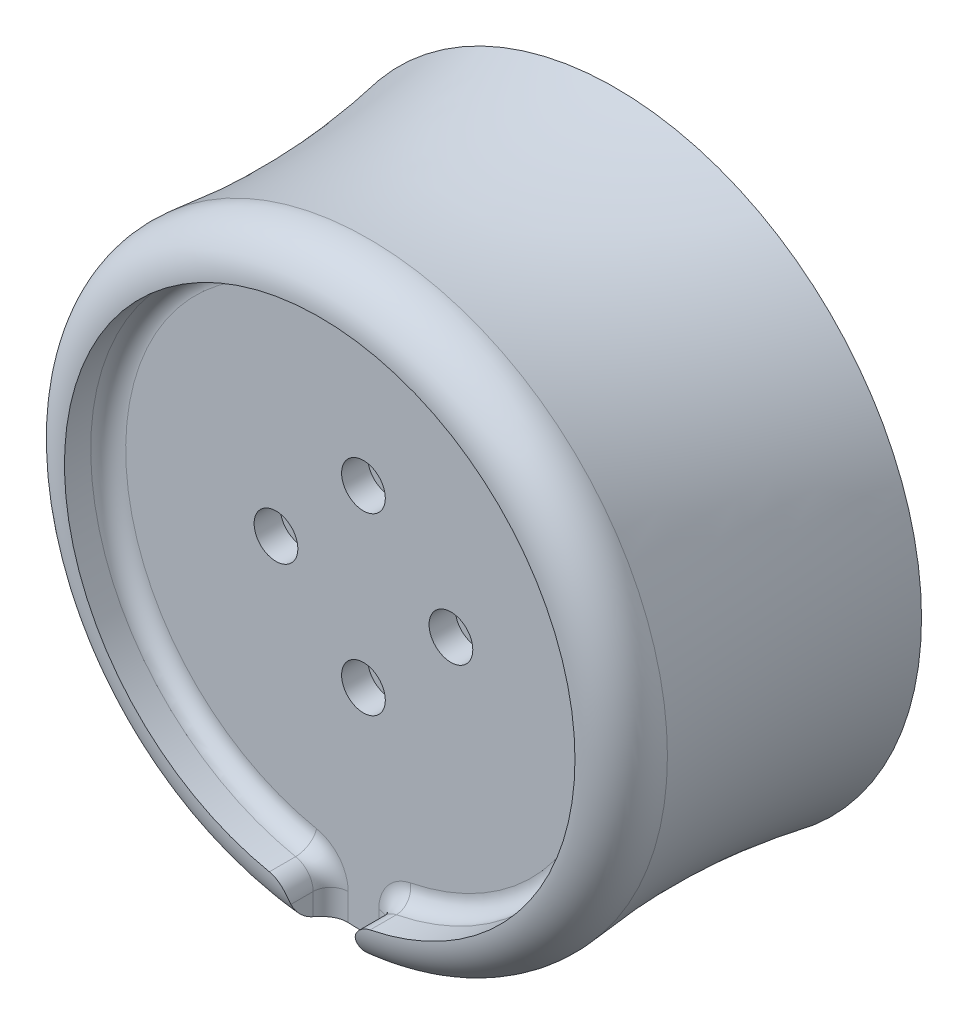
ISO-10303-21;
HEADER;
FILE_DESCRIPTION(('STEP AP214'),'2;1');
FILE_NAME('part.step','',(''),(''),'','','');
FILE_SCHEMA(('AUTOMOTIVE_DESIGN { 1 0 10303 214 1 1 1 1 }'));
ENDSEC;
DATA;
#1=APPLICATION_CONTEXT('core data for automotive mechanical design processes');
#2=APPLICATION_PROTOCOL_DEFINITION('international standard','automotive_design',2000,#1);
#3=PRODUCT_CONTEXT('',#1,'mechanical');
#4=PRODUCT('Part','Part','',(#3));
#5=PRODUCT_RELATED_PRODUCT_CATEGORY('part','',(#4));
#6=PRODUCT_DEFINITION_FORMATION('','',#4);
#7=PRODUCT_DEFINITION_CONTEXT('part definition',#1,'design');
#8=PRODUCT_DEFINITION('design','',#6,#7);
#9=PRODUCT_DEFINITION_SHAPE('','',#8);
#10=(LENGTH_UNIT() NAMED_UNIT(*) SI_UNIT(.MILLI.,.METRE.));
#11=(NAMED_UNIT(*) PLANE_ANGLE_UNIT() SI_UNIT($,.RADIAN.));
#12=(NAMED_UNIT(*) SI_UNIT($,.STERADIAN.) SOLID_ANGLE_UNIT());
#13=UNCERTAINTY_MEASURE_WITH_UNIT(LENGTH_MEASURE(1.E-05),#10,'distance_accuracy_value','');
#14=(GEOMETRIC_REPRESENTATION_CONTEXT(3) GLOBAL_UNCERTAINTY_ASSIGNED_CONTEXT((#13)) GLOBAL_UNIT_ASSIGNED_CONTEXT((#10,
#11,#12)) REPRESENTATION_CONTEXT('',''));
#15=CARTESIAN_POINT('',(0.,0.,0.));
#16=DIRECTION('',(0.,0.,1.));
#17=DIRECTION('',(1.,0.,0.));
#18=AXIS2_PLACEMENT_3D('',#15,#16,#17);
#19=CARTESIAN_POINT('',(0.,-10.,15.001));
#20=DIRECTION('',(0.,0.,-1.));
#21=DIRECTION('',(-1.,0.,0.));
#22=AXIS2_PLACEMENT_3D('',#19,#20,#21);
#23=CYLINDRICAL_SURFACE('',#22,1.5);
#24=CARTESIAN_POINT('',(0.,-10.,0.));
#25=DIRECTION('',(0.,0.,1.));
#26=DIRECTION('',(1.,0.,0.));
#27=AXIS2_PLACEMENT_3D('',#24,#25,#26);
#28=CIRCLE('',#27,1.5);
#29=CARTESIAN_POINT('',(1.5,-10.,0.));
#30=VERTEX_POINT('',#29);
#31=EDGE_CURVE('E280',#30,#30,#28,.T.);
#32=ORIENTED_EDGE('',*,*,#31,.F.);
#33=EDGE_LOOP('',(#32));
#34=FACE_BOUND('',#33,.T.);
#35=CARTESIAN_POINT('',(0.,-10.,6.99999999999999));
#36=DIRECTION('',(0.,0.,1.));
#37=DIRECTION('',(1.,0.,0.));
#38=AXIS2_PLACEMENT_3D('',#35,#36,#37);
#39=CIRCLE('',#38,1.5);
#40=CARTESIAN_POINT('',(1.5,-10.,6.99999999999999));
#41=VERTEX_POINT('',#40);
#42=EDGE_CURVE('E48',#41,#41,#39,.T.);
#43=ORIENTED_EDGE('',*,*,#42,.T.);
#44=EDGE_LOOP('',(#43));
#45=FACE_BOUND('',#44,.T.);
#46=ADVANCED_FACE('F43',(#34,#45),#23,.F.);
#47=CARTESIAN_POINT('',(10.,0.,15.001));
#48=DIRECTION('',(0.,0.,-1.));
#49=DIRECTION('',(-1.,0.,0.));
#50=AXIS2_PLACEMENT_3D('',#47,#48,#49);
#51=CYLINDRICAL_SURFACE('',#50,1.5);
#52=CARTESIAN_POINT('',(10.,0.,0.));
#53=DIRECTION('',(0.,0.,1.));
#54=DIRECTION('',(1.,0.,0.));
#55=AXIS2_PLACEMENT_3D('',#52,#53,#54);
#56=CIRCLE('',#55,1.5);
#57=CARTESIAN_POINT('',(11.5,0.,0.));
#58=VERTEX_POINT('',#57);
#59=EDGE_CURVE('E284',#58,#58,#56,.T.);
#60=ORIENTED_EDGE('',*,*,#59,.F.);
#61=EDGE_LOOP('',(#60));
#62=FACE_BOUND('',#61,.T.);
#63=CARTESIAN_POINT('',(10.,0.,6.99999999999999));
#64=DIRECTION('',(0.,0.,1.));
#65=DIRECTION('',(1.,0.,0.));
#66=AXIS2_PLACEMENT_3D('',#63,#64,#65);
#67=CIRCLE('',#66,1.5);
#68=CARTESIAN_POINT('',(11.5,0.,6.99999999999999));
#69=VERTEX_POINT('',#68);
#70=EDGE_CURVE('E275',#69,#69,#67,.T.);
#71=ORIENTED_EDGE('',*,*,#70,.T.);
#72=EDGE_LOOP('',(#71));
#73=FACE_BOUND('',#72,.T.);
#74=ADVANCED_FACE('F362',(#62,#73),#51,.F.);
#75=CARTESIAN_POINT('',(0.,10.,15.001));
#76=DIRECTION('',(0.,0.,-1.));
#77=DIRECTION('',(-1.,0.,0.));
#78=AXIS2_PLACEMENT_3D('',#75,#76,#77);
#79=CYLINDRICAL_SURFACE('',#78,1.5);
#80=CARTESIAN_POINT('',(0.,10.,0.));
#81=DIRECTION('',(0.,0.,1.));
#82=DIRECTION('',(1.,0.,0.));
#83=AXIS2_PLACEMENT_3D('',#80,#81,#82);
#84=CIRCLE('',#83,1.5);
#85=CARTESIAN_POINT('',(1.5,10.,0.));
#86=VERTEX_POINT('',#85);
#87=EDGE_CURVE('E289',#86,#86,#84,.T.);
#88=ORIENTED_EDGE('',*,*,#87,.F.);
#89=EDGE_LOOP('',(#88));
#90=FACE_BOUND('',#89,.T.);
#91=CARTESIAN_POINT('',(0.,10.,6.99999999999999));
#92=DIRECTION('',(0.,0.,1.));
#93=DIRECTION('',(1.,0.,0.));
#94=AXIS2_PLACEMENT_3D('',#91,#92,#93);
#95=CIRCLE('',#94,1.5);
#96=CARTESIAN_POINT('',(1.5,10.,6.99999999999999));
#97=VERTEX_POINT('',#96);
#98=EDGE_CURVE('E272',#97,#97,#95,.T.);
#99=ORIENTED_EDGE('',*,*,#98,.T.);
#100=EDGE_LOOP('',(#99));
#101=FACE_BOUND('',#100,.T.);
#102=ADVANCED_FACE('F368',(#90,#101),#79,.F.);
#103=CARTESIAN_POINT('',(-10.,0.,15.001));
#104=DIRECTION('',(0.,0.,-1.));
#105=DIRECTION('',(-1.,0.,0.));
#106=AXIS2_PLACEMENT_3D('',#103,#104,#105);
#107=CYLINDRICAL_SURFACE('',#106,1.5);
#108=CARTESIAN_POINT('',(-10.,0.,0.));
#109=DIRECTION('',(0.,0.,1.));
#110=DIRECTION('',(1.,0.,0.));
#111=AXIS2_PLACEMENT_3D('',#108,#109,#110);
#112=CIRCLE('',#111,1.5);
#113=CARTESIAN_POINT('',(-8.5,0.,0.));
#114=VERTEX_POINT('',#113);
#115=EDGE_CURVE('E296',#114,#114,#112,.T.);
#116=ORIENTED_EDGE('',*,*,#115,.F.);
#117=EDGE_LOOP('',(#116));
#118=FACE_BOUND('',#117,.T.);
#119=CARTESIAN_POINT('',(-10.,0.,6.99999999999999));
#120=DIRECTION('',(0.,0.,1.));
#121=DIRECTION('',(1.,0.,0.));
#122=AXIS2_PLACEMENT_3D('',#119,#120,#121);
#123=CIRCLE('',#122,1.5);
#124=CARTESIAN_POINT('',(-8.5,0.,6.99999999999999));
#125=VERTEX_POINT('',#124);
#126=EDGE_CURVE('E269',#125,#125,#123,.T.);
#127=ORIENTED_EDGE('',*,*,#126,.T.);
#128=EDGE_LOOP('',(#127));
#129=FACE_BOUND('',#128,.T.);
#130=ADVANCED_FACE('F374',(#118,#129),#107,.F.);
#131=CARTESIAN_POINT('',(1.06401134813455E-06,-1.62435410016243E-06,10.));
#132=DIRECTION('',(0.,0.,1.));
#133=DIRECTION('',(1.,0.,0.));
#134=AXIS2_PLACEMENT_3D('',#131,#132,#133);
#135=TOROIDAL_SURFACE('',#134,29.1827189766862,5.);
#136=CARTESIAN_POINT('',(1.06401134813455E-06,-1.62435410016243E-06,9.39415576190585));
#137=DIRECTION('',(0.,0.,1.));
#138=DIRECTION('',(1.,0.,0.));
#139=AXIS2_PLACEMENT_3D('',#136,#137,#138);
#140=CIRCLE('',#139,34.1458785307574);
#141=CARTESIAN_POINT('',(34.1458795947687,-1.62435410016243E-06,9.39415576190585));
#142=VERTEX_POINT('',#141);
#143=EDGE_CURVE('E189',#142,#142,#140,.F.);
#144=ORIENTED_EDGE('',*,*,#143,.F.);
#145=EDGE_LOOP('',(#144));
#146=FACE_BOUND('',#145,.T.);
#147=CARTESIAN_POINT('',(1.06401134813455E-06,-1.62435410016243E-06,15.));
#148=DIRECTION('',(0.,0.,1.));
#149=DIRECTION('',(1.,0.,0.));
#150=AXIS2_PLACEMENT_3D('',#147,#148,#149);
#151=CIRCLE('',#150,29.1827189766862);
#152=CARTESIAN_POINT('',(5.75683000721229,-28.6092659873356,15.));
#153=VERTEX_POINT('',#152);
#154=CARTESIAN_POINT('',(-5.75682787918959,-28.6092659873356,15.));
#155=VERTEX_POINT('',#154);
#156=EDGE_CURVE('E106',#153,#155,#151,.T.);
#157=ORIENTED_EDGE('',*,*,#156,.F.);
#158=CARTESIAN_POINT('',(5.75703000721229,-28.6092257513176,15.));
#159=CARTESIAN_POINT('',(5.68832998449904,-28.6230371625088,14.9999871998787));
#160=CARTESIAN_POINT('',(5.62021669133831,-28.6397493216957,14.9999996740973));
#161=CARTESIAN_POINT('',(5.48563431043244,-28.6788281661339,14.9999820111386));
#162=CARTESIAN_POINT('',(5.41916516820022,-28.7011946637242,14.9999518753753));
#163=CARTESIAN_POINT('',(5.28832960792425,-28.7514390719539,14.9997558324967));
#164=CARTESIAN_POINT('',(5.22396343526671,-28.779317623113,14.9995899095953));
#165=CARTESIAN_POINT('',(5.0978165263207,-28.8403677165544,14.9989402843598));
#166=CARTESIAN_POINT('',(5.03603575778169,-28.8735391927875,14.9984565859909));
#167=CARTESIAN_POINT('',(4.85514646070722,-28.9807202833952,14.9961884867993));
#168=CARTESIAN_POINT('',(4.74046661279283,-29.0624059264283,14.9935872044233));
#169=CARTESIAN_POINT('',(4.52662323146752,-29.2436531010309,14.9837761085428));
#170=CARTESIAN_POINT('',(4.42745177833704,-29.3432054523999,14.9765686569139));
#171=CARTESIAN_POINT('',(4.24866757846273,-29.5555954549403,14.954874224376));
#172=CARTESIAN_POINT('',(4.16880731057768,-29.6682341404071,14.9404875185209));
#173=CARTESIAN_POINT('',(4.02923241609239,-29.9038853809484,14.9019588123823));
#174=CARTESIAN_POINT('',(3.96951608054031,-30.0268970549019,14.8778176400211));
#175=CARTESIAN_POINT('',(3.87369524358881,-30.2728512884748,14.8193692423207));
#176=CARTESIAN_POINT('',(3.83665457524941,-30.3955511272405,14.7855647004469));
#177=CARTESIAN_POINT('',(3.78206900749627,-30.6416218524598,14.7068833744649));
#178=CARTESIAN_POINT('',(3.76450007245479,-30.7649917222791,14.6620203246719));
#179=CARTESIAN_POINT('',(3.75399808122662,-30.9158006454995,14.5998637642307));
#180=CARTESIAN_POINT('',(3.75248935051304,-30.9448985836727,14.587525909975));
#181=CARTESIAN_POINT('',(3.75049143797669,-31.0028186513692,14.5622730103202));
#182=CARTESIAN_POINT('',(3.75000050344504,-31.0316411698143,14.5493589963578));
#183=CARTESIAN_POINT('',(3.75000107201135,-31.0603397720777,14.5361502052489));
#184=B_SPLINE_CURVE_WITH_KNOTS('',3,(#158,#159,#160,#161,#162,#163,#164,#165,#166,#167,#168,
#169,#170,#171,#172,#173,#174,#175,#176,#177,#178,#179,#180,#181,#182,#183),.UNSPECIFIED.,.F.,
.F.,(4,2,2,2,2,2,2,2,2,2,2,2,4),(0.,0.210155754275721,0.420304534643088,0.630477749394817,
0.840648341647218,1.2609123032174,1.68096094146647,2.09530026909337,2.50960443654746,
2.90538837865218,3.30068322472758,3.39559672569786,3.49034664343927),.UNSPECIFIED.);
#185=CARTESIAN_POINT('',(3.75000106401135,-31.0601397720777,14.5362422613521));
#186=VERTEX_POINT('',#185);
#187=EDGE_CURVE('E138',#153,#186,#184,.T.);
#188=ORIENTED_EDGE('',*,*,#187,.T.);
#189=CARTESIAN_POINT('',(3.75000106401135,-33.3965622009988,7.66961397242508));
#190=CARTESIAN_POINT('',(3.75000106401135,-33.4621134050494,7.79323834636816));
#191=CARTESIAN_POINT('',(3.75000106401135,-33.5224344316463,7.91963402166265));
#192=CARTESIAN_POINT('',(3.75000106401135,-33.6322364008597,8.17704446599516));
#193=CARTESIAN_POINT('',(3.75000106401135,-33.6817177061019,8.30805908034361));
#194=CARTESIAN_POINT('',(3.75000106401135,-33.7694357397727,8.57370385785014));
#195=CARTESIAN_POINT('',(3.75000106401135,-33.807679930297,8.70833155658294));
#196=CARTESIAN_POINT('',(3.75000106401135,-33.8726920700627,8.98032762080989));
#197=CARTESIAN_POINT('',(3.75000106401135,-33.899460210866,9.11769594051665));
#198=CARTESIAN_POINT('',(3.75000106401135,-33.9413313617661,9.3942496567132));
#199=CARTESIAN_POINT('',(3.75000106401135,-33.9564301856227,9.53343568709522));
#200=CARTESIAN_POINT('',(3.75000106401135,-33.9748396706549,9.81263693813682));
#201=CARTESIAN_POINT('',(3.75000106401135,-33.9781459721785,9.95265244629387));
#202=CARTESIAN_POINT('',(3.75000106401135,-33.9729354659781,10.2323798490424));
#203=CARTESIAN_POINT('',(3.75000106401135,-33.9644256898706,10.3720918746922));
#204=CARTESIAN_POINT('',(3.75000106401135,-33.9356527043487,10.6503525145116));
#205=CARTESIAN_POINT('',(3.75000106401135,-33.9153851587132,10.78890068032));
#206=CARTESIAN_POINT('',(3.75000106401135,-33.8632793798893,11.0635982913567));
#207=CARTESIAN_POINT('',(3.75000106401135,-33.8314577271811,11.1997508822245));
#208=CARTESIAN_POINT('',(3.75000106401135,-33.7564583196826,11.4689454902845));
#209=CARTESIAN_POINT('',(3.75000106401135,-33.7132763856583,11.6019863430729));
#210=CARTESIAN_POINT('',(3.75000106401135,-33.6158869697604,11.8639380354645));
#211=CARTESIAN_POINT('',(3.75000106401135,-33.5616817461757,11.9928497147405));
#212=CARTESIAN_POINT('',(3.75000106401135,-33.4426125655434,12.2457106056338));
#213=CARTESIAN_POINT('',(3.75000106401135,-33.3777446837335,12.3696579689907));
#214=CARTESIAN_POINT('',(3.75000106401135,-33.2377395686486,12.6118350732133));
#215=CARTESIAN_POINT('',(3.75000106401135,-33.1625884944232,12.7300568120917));
#216=CARTESIAN_POINT('',(3.75000106401135,-33.0026010112961,12.9598147790001));
#217=CARTESIAN_POINT('',(3.75000106401135,-32.9177612468191,13.071348670244));
#218=CARTESIAN_POINT('',(3.75000106401135,-32.7390501468268,13.2868853909121));
#219=CARTESIAN_POINT('',(3.75000106401135,-32.6451808990031,13.3908899514804));
#220=CARTESIAN_POINT('',(3.75000106401135,-32.4490674336738,13.59067845103));
#221=CARTESIAN_POINT('',(3.75000106401135,-32.3468231606545,13.6864623355122));
#222=CARTESIAN_POINT('',(3.75000106401135,-32.1341593112307,13.8696088250649));
#223=CARTESIAN_POINT('',(3.75000106401135,-32.023701453301,13.9569269801217));
#224=CARTESIAN_POINT('',(3.75000106401135,-31.795894374242,14.1219688070747));
#225=CARTESIAN_POINT('',(3.75000106401135,-31.6785474903176,14.1996957055036));
#226=CARTESIAN_POINT('',(3.75000106401135,-31.4377186177193,14.3450883561295));
#227=CARTESIAN_POINT('',(3.75000106401135,-31.3142343502166,14.4127503333916));
#228=CARTESIAN_POINT('',(3.75000106401135,-31.0620913028455,14.537500179445));
#229=CARTESIAN_POINT('',(3.75000106401135,-30.9334343880727,14.5945918186831));
#230=CARTESIAN_POINT('',(3.75000106401135,-30.6709051677889,14.6982078678585));
#231=CARTESIAN_POINT('',(3.75000106401135,-30.5370029799526,14.7446565748401));
#232=CARTESIAN_POINT('',(3.75000106401135,-30.2658264499712,14.8261543025641));
#233=CARTESIAN_POINT('',(3.75000106401135,-30.1285533319598,14.8612073975923));
#234=CARTESIAN_POINT('',(3.75000106401135,-29.8514754639542,14.9197245208157));
#235=CARTESIAN_POINT('',(3.75000106401135,-29.7116692854629,14.9431817845293));
#236=CARTESIAN_POINT('',(3.75000106401135,-29.4306367723273,14.9783205918707));
#237=CARTESIAN_POINT('',(3.75000106401135,-29.2894109680023,14.9900063790179));
#238=CARTESIAN_POINT('',(3.75000106401135,-29.0054500476291,15.0015892089158));
#239=CARTESIAN_POINT('',(3.75000106401135,-28.8627114136897,15.0014001371369));
#240=CARTESIAN_POINT('',(3.75000106401135,-28.5778068933774,14.9890313060825));
#241=CARTESIAN_POINT('',(3.75000106401135,-28.4356408176648,14.9768559056122));
#242=CARTESIAN_POINT('',(3.75000106401135,-28.1529290824407,14.9406240335261));
#243=CARTESIAN_POINT('',(3.75000106401135,-28.0123823952564,14.9165755760723));
#244=CARTESIAN_POINT('',(3.75000106401135,-27.7338524607278,14.8567821117102));
#245=CARTESIAN_POINT('',(3.75000106401135,-27.5958682567275,14.8210415665245));
#246=CARTESIAN_POINT('',(3.75000106401135,-27.3344415223277,14.7414727179522));
#247=CARTESIAN_POINT('',(3.75000106401135,-27.2107270291989,14.6985350786621));
#248=CARTESIAN_POINT('',(3.75000106401135,-26.9671993648477,14.6033367924389));
#249=CARTESIAN_POINT('',(3.75000106401135,-26.847379486542,14.5510933008536));
#250=CARTESIAN_POINT('',(3.75000106401135,-26.7297537445027,14.4942904623493));
#251=B_SPLINE_CURVE_WITH_KNOTS('',3,(#189,#190,#191,#192,#193,#194,#195,#196,#197,#198,#199,
#200,#201,#202,#203,#204,#205,#206,#207,#208,#209,#210,#211,#212,#213,#214,#215,#216,#217,#218,
#219,#220,#221,#222,#223,#224,#225,#226,#227,#228,#229,#230,#231,#232,#233,#234,#235,#236,#237,
#238,#239,#240,#241,#242,#243,#244,#245,#246,#247,#248,#249,#250),.UNSPECIFIED.,.F.,.F.,(4,2,2,
2,2,2,2,2,2,2,2,2,2,2,2,2,2,2,2,2,2,2,2,2,2,2,2,2,2,2,4),(0.,0.419659087301407,
0.839304133428598,1.25866987782436,1.67802862176067,2.09753773633324,2.51720192581126,
2.93661648479699,3.35618582071108,3.77515542677793,4.19427937994167,4.61331755551059,
5.032510319474,5.45227296181559,5.87218142794517,6.29199304003642,6.71180743506706,
7.13371862002934,7.55548748338059,7.97741413805315,8.39919000001577,8.82387875036997,
9.24841549386549,9.67319960143206,10.0978305229989,10.525541151446,10.9530963011803,
11.3803632503828,11.8074673435357,12.1999433282897,12.5917031333988),.UNSPECIFIED.);
#252=CARTESIAN_POINT('',(3.75000106401135,-33.5564112097495,12.));
#253=VERTEX_POINT('',#252);
#254=EDGE_CURVE('E118',#253,#186,#251,.T.);
#255=ORIENTED_EDGE('',*,*,#254,.F.);
#256=CARTESIAN_POINT('',(1.74980106401135,-34.1379054352079,10.00000001));
#257=CARTESIAN_POINT('',(1.80607482142934,-34.1350163226067,9.99999472742265));
#258=CARTESIAN_POINT('',(1.86231506463749,-34.1319992507641,10.0023653398727));
#259=CARTESIAN_POINT('',(1.97437824285472,-34.1256887651937,10.0118299673007));
#260=CARTESIAN_POINT('',(2.03020119812881,-34.1223953649817,10.0189237513777));
#261=CARTESIAN_POINT('',(2.19634984010478,-34.1120805993846,10.047217458573));
#262=CARTESIAN_POINT('',(2.30553736633898,-34.1046155656428,10.0754299244469));
#263=CARTESIAN_POINT('',(2.51751968857716,-34.0879434499179,10.1497156835025));
#264=CARTESIAN_POINT('',(2.62031111446832,-34.0787354597254,10.1957983015447));
#265=CARTESIAN_POINT('',(2.81651486998352,-34.0576218569555,10.3043855100301));
#266=CARTESIAN_POINT('',(2.90992880234503,-34.0457167064951,10.3668872875947));
#267=CARTESIAN_POINT('',(3.08446262087902,-34.0180901639912,10.5061298052556));
#268=CARTESIAN_POINT('',(3.16560999239232,-34.0023775154686,10.5828378283962));
#269=CARTESIAN_POINT('',(3.31356778799488,-33.9659941059987,10.7479839395788));
#270=CARTESIAN_POINT('',(3.38038096969655,-33.945324300333,10.8364197661186));
#271=CARTESIAN_POINT('',(3.49759139805373,-33.8982913893976,11.0213109816377));
#272=CARTESIAN_POINT('',(3.548096356478,-33.8719676357979,11.1177082398663));
#273=CARTESIAN_POINT('',(3.63240594927773,-33.8130454604137,11.3157929759292));
#274=CARTESIAN_POINT('',(3.66620455965955,-33.7804447811673,11.4174823474126));
#275=CARTESIAN_POINT('',(3.71131302528446,-33.7169285885542,11.5999605609242));
#276=CARTESIAN_POINT('',(3.72594809994947,-33.6872430086672,11.6803826872926));
#277=CARTESIAN_POINT('',(3.74529904518429,-33.624366675423,11.8408554273887));
#278=CARTESIAN_POINT('',(3.75003614150926,-33.5911835832907,11.9209064680306));
#279=CARTESIAN_POINT('',(3.75000105401135,-33.5563233751282,12.0002));
#280=B_SPLINE_CURVE_WITH_KNOTS('',3,(#256,#257,#258,#259,#260,#261,#262,#263,#264,#265,#266,
#267,#268,#269,#270,#271,#272,#273,#274,#275,#276,#277,#278,#279),.UNSPECIFIED.,.F.,.F.,(4,2,2,
2,2,2,2,2,2,2,2,4),(0.,0.168939535122236,0.337870811927734,0.675193449346945,1.012692343152,
1.35013345537785,1.68680689301819,2.02341550320501,2.35775312520345,2.69221121525026,
2.95248898700151,3.2122080298916),.UNSPECIFIED.);
#281=CARTESIAN_POINT('',(1.75000106401135,-34.1378951832587,9.99999999999999));
#282=VERTEX_POINT('',#281);
#283=EDGE_CURVE('E153',#282,#253,#280,.T.);
#284=ORIENTED_EDGE('',*,*,#283,.F.);
#285=CARTESIAN_POINT('',(1.06401134813455E-06,-1.62435410016243E-06,9.99999999999999));
#286=DIRECTION('',(0.,0.,1.));
#287=DIRECTION('',(1.,0.,0.));
#288=AXIS2_PLACEMENT_3D('',#285,#286,#287);
#289=CIRCLE('',#288,34.1827189766862);
#290=CARTESIAN_POINT('',(-1.74999893598865,-34.1378951832602,9.99999999999999));
#291=VERTEX_POINT('',#290);
#292=EDGE_CURVE('E132',#282,#291,#289,.F.);
#293=ORIENTED_EDGE('',*,*,#292,.T.);
#294=CARTESIAN_POINT('',(-3.74999892598865,-33.5563233751282,12.0002));
#295=CARTESIAN_POINT('',(-3.7500100082844,-33.5799159071336,11.9464994746148));
#296=CARTESIAN_POINT('',(-3.74784656661752,-33.6027535601384,11.8924580765947));
#297=CARTESIAN_POINT('',(-3.7390506987546,-33.6468434117974,11.784071329534));
#298=CARTESIAN_POINT('',(-3.73241662885449,-33.6680950241228,11.7297258759927));
#299=CARTESIAN_POINT('',(-3.71455125169411,-33.7089382107278,11.6210994541109));
#300=CARTESIAN_POINT('',(-3.70331576219372,-33.7285282552006,11.5668185896067));
#301=CARTESIAN_POINT('',(-3.67620166169415,-33.7659737494058,11.458846742562));
#302=CARTESIAN_POINT('',(-3.66032369920244,-33.7838294409463,11.4051556787183));
#303=CARTESIAN_POINT('',(-3.60557941216805,-33.8348583779475,11.2453602737075));
#304=CARTESIAN_POINT('',(-3.55963433967509,-33.8654201078503,11.1407315710925));
#305=CARTESIAN_POINT('',(-3.44968593385827,-33.9197771604209,10.9397225804268));
#306=CARTESIAN_POINT('',(-3.38570245617398,-33.9435798655311,10.8433333739994));
#307=CARTESIAN_POINT('',(-3.244426798129,-33.9844666058572,10.6662243997207));
#308=CARTESIAN_POINT('',(-3.1678276957084,-34.0017961524048,10.5850080916809));
#309=CARTESIAN_POINT('',(-3.00166633577307,-34.0322152036987,10.4361011320955));
#310=CARTESIAN_POINT('',(-2.91209853329747,-34.0453028869822,10.3684162957529));
#311=CARTESIAN_POINT('',(-2.72333250702183,-34.0683137703683,10.2492877747365));
#312=CARTESIAN_POINT('',(-2.62420989493621,-34.0782595195262,10.1977283888079));
#313=CARTESIAN_POINT('',(-2.41864066125449,-34.0961350297592,10.1117966267662));
#314=CARTESIAN_POINT('',(-2.3121984337847,-34.1040659871623,10.0774140397618));
#315=CARTESIAN_POINT('',(-2.12930972946125,-34.1163269623679,10.034812647409));
#316=CARTESIAN_POINT('',(-2.05397465792232,-34.1210043895167,10.0217640651988));
#317=CARTESIAN_POINT('',(-1.90237324619009,-34.1298284403817,10.0043531192467));
#318=CARTESIAN_POINT('',(-1.82610819392073,-34.1339757231333,9.9999798707809));
#319=CARTESIAN_POINT('',(-1.74979893598865,-34.1379054352078,10.00000001));
#320=B_SPLINE_CURVE_WITH_KNOTS('',3,(#294,#295,#296,#297,#298,#299,#300,#301,#302,#303,#304,
#305,#306,#307,#308,#309,#310,#311,#312,#313,#314,#315,#316,#317,#318,#319),.UNSPECIFIED.,.F.,
.F.,(4,2,2,2,2,2,2,2,2,2,2,2,4),(0.,0.175928946184365,0.351922611015461,0.528076593126408,
0.704205980018564,1.057096491558,1.40960006805211,1.74689919685145,2.08434297113459,
2.41930685915874,2.75407138746194,2.98340011444387,3.21244092596891),.UNSPECIFIED.);
#321=CARTESIAN_POINT('',(-3.74999893598865,-33.5564112097497,11.9999999999996));
#322=VERTEX_POINT('',#321);
#323=EDGE_CURVE('E182',#322,#291,#320,.T.);
#324=ORIENTED_EDGE('',*,*,#323,.F.);
#325=CARTESIAN_POINT('',(-3.74999893598865,-26.7297537445027,14.4942904623493));
#326=CARTESIAN_POINT('',(-3.74999893598865,-26.8585293035351,14.5564823262417));
#327=CARTESIAN_POINT('',(-3.74999893598865,-26.9899415603892,14.6132057910819));
#328=CARTESIAN_POINT('',(-3.74999893598865,-27.257069237081,14.7153819867528));
#329=CARTESIAN_POINT('',(-3.74999893598865,-27.392784420293,14.7608353361393));
#330=CARTESIAN_POINT('',(-3.74999893598865,-27.6674774046834,14.840119829836));
#331=CARTESIAN_POINT('',(-3.74999893598865,-27.806453143817,14.8739581187874));
#332=CARTESIAN_POINT('',(-3.74999893598865,-28.0867579421495,14.9298188200006));
#333=CARTESIAN_POINT('',(-3.74999893598865,-28.2280869805479,14.9518413366433));
#334=CARTESIAN_POINT('',(-3.74999893598865,-28.5121332671556,14.9839165146191));
#335=CARTESIAN_POINT('',(-3.74999893598865,-28.6548508575822,14.9939661457464));
#336=CARTESIAN_POINT('',(-3.74999893598865,-28.9406783854609,15.0020103064424));
#337=CARTESIAN_POINT('',(-3.74999893598865,-29.0837884483323,15.0000003831255));
#338=CARTESIAN_POINT('',(-3.74999893598865,-29.3692480351541,14.9839243422799));
#339=CARTESIAN_POINT('',(-3.74999893598865,-29.5115979467149,14.969865109544));
#340=CARTESIAN_POINT('',(-3.74999893598865,-29.7946567075288,14.9297794640066));
#341=CARTESIAN_POINT('',(-3.74999893598865,-29.9353649332938,14.9037486471352));
#342=CARTESIAN_POINT('',(-3.74999893598865,-30.2139303975436,14.8399227559847));
#343=CARTESIAN_POINT('',(-3.74999893598865,-30.3517905058403,14.8021402082263));
#344=CARTESIAN_POINT('',(-3.74999893598865,-30.6238737398235,14.7150384255456));
#345=CARTESIAN_POINT('',(-3.74999893598865,-30.7580954994373,14.6657149225544));
#346=CARTESIAN_POINT('',(-3.74999893598865,-31.0218475533197,14.5558871265471));
#347=CARTESIAN_POINT('',(-3.74999893598865,-31.1513789377597,14.4953854518537));
#348=CARTESIAN_POINT('',(-3.74999893598865,-31.4048887134898,14.3635857870376));
#349=CARTESIAN_POINT('',(-3.74999893598865,-31.5288650528415,14.2922838493963));
#350=CARTESIAN_POINT('',(-3.74999893598865,-31.7696222375671,14.1398303664778));
#351=CARTESIAN_POINT('',(-3.74999893598865,-31.886439868541,14.0587369107844));
#352=CARTESIAN_POINT('',(-3.74999893598865,-32.1128273087721,13.886917199493));
#353=CARTESIAN_POINT('',(-3.74999893598865,-32.2223945854807,13.7961876065194));
#354=CARTESIAN_POINT('',(-3.74999893598865,-32.433406138338,13.6057813769361));
#355=CARTESIAN_POINT('',(-3.74999893598865,-32.5348525364255,13.5061070920559));
#356=CARTESIAN_POINT('',(-3.74999893598865,-32.728906672082,13.2984973170746));
#357=CARTESIAN_POINT('',(-3.74999893598865,-32.8215144781407,13.1905618910004));
#358=CARTESIAN_POINT('',(-3.74999893598865,-32.9966202806631,12.9679446265547));
#359=CARTESIAN_POINT('',(-3.74999893598865,-33.0791815577396,12.8533125593519));
#360=CARTESIAN_POINT('',(-3.74999893598865,-33.234273300663,12.6175106895766));
#361=CARTESIAN_POINT('',(-3.74999893598865,-33.3068073504142,12.4963432444987));
#362=CARTESIAN_POINT('',(-3.74999893598865,-33.4413669851233,12.248255394538));
#363=CARTESIAN_POINT('',(-3.74999893598865,-33.5033890991865,12.1213331069518));
#364=CARTESIAN_POINT('',(-3.74999893598865,-33.6164153414871,11.8627302661751));
#365=CARTESIAN_POINT('',(-3.74999893598865,-33.6674236004647,11.7310515185965));
#366=CARTESIAN_POINT('',(-3.74999893598865,-33.7578154200777,11.4645969086221));
#367=CARTESIAN_POINT('',(-3.74999893598865,-33.7972633385932,11.3298428758164));
#368=CARTESIAN_POINT('',(-3.74999893598865,-33.8646179679987,11.0575341464838));
#369=CARTESIAN_POINT('',(-3.74999893598865,-33.8925290160626,10.9199805228783));
#370=CARTESIAN_POINT('',(-3.74999893598865,-33.9366380411426,10.6429276235234));
#371=CARTESIAN_POINT('',(-3.74999893598865,-33.9528293542789,10.5034272867396));
#372=CARTESIAN_POINT('',(-3.74999893598865,-33.9733496131894,10.2236088811398));
#373=CARTESIAN_POINT('',(-3.74999893598865,-33.9776829673378,10.0832911356548));
#374=CARTESIAN_POINT('',(-3.74999893598865,-33.9744720889509,9.8031446870975));
#375=CARTESIAN_POINT('',(-3.74999893598865,-33.9669576730918,9.66331564111294));
#376=CARTESIAN_POINT('',(-3.74999893598865,-33.9401669310381,9.3848413236233));
#377=CARTESIAN_POINT('',(-3.74999893598865,-33.9208950109479,9.246195628386));
#378=CARTESIAN_POINT('',(-3.74999893598865,-33.8707549188328,8.97113190096153));
#379=CARTESIAN_POINT('',(-3.74999893598865,-33.8398958841923,8.83471220161503));
#380=CARTESIAN_POINT('',(-3.74999893598865,-33.7668182647375,8.56500432556401));
#381=CARTESIAN_POINT('',(-3.74999893598865,-33.7246043847912,8.43171487665922));
#382=CARTESIAN_POINT('',(-3.74999893598865,-33.6374766902663,8.19213274375513));
#383=CARTESIAN_POINT('',(-3.74999893598865,-33.5943257682212,8.08519492190194));
#384=CARTESIAN_POINT('',(-3.74999893598865,-33.5008053337703,7.87475911463512));
#385=CARTESIAN_POINT('',(-3.74999893598865,-33.4504492285934,7.77125517067212));
#386=CARTESIAN_POINT('',(-3.74999893598865,-33.3965622009989,7.66961397242507));
#387=B_SPLINE_CURVE_WITH_KNOTS('',3,(#325,#326,#327,#328,#329,#330,#331,#332,#333,#334,#335,
#336,#337,#338,#339,#340,#341,#342,#343,#344,#345,#346,#347,#348,#349,#350,#351,#352,#353,#354,
#355,#356,#357,#358,#359,#360,#361,#362,#363,#364,#365,#366,#367,#368,#369,#370,#371,#372,#373,
#374,#375,#376,#377,#378,#379,#380,#381,#382,#383,#384,#385,#386),.UNSPECIFIED.,.F.,.F.,(4,2,2,
2,2,2,2,2,2,2,2,2,2,2,2,2,2,2,2,2,2,2,2,2,2,2,2,2,2,2,4),(0.,0.428887973980041,
0.857752403398891,1.28635255553221,1.71494892133423,2.14365373714121,2.57251685821213,
3.00113509663689,3.42991114011759,3.85823169571899,4.28671090361539,4.71508987349205,
5.14362579628352,5.56973392962863,5.99599012532393,6.42213457668699,6.84827572561096,
7.27157603991752,7.69472466603704,8.11801273889469,8.5411417809866,8.96186839854572,
9.38243670386775,9.80324395825304,10.2238947499537,10.6434885999608,11.0629253043993,
11.4820319410938,11.9009651881987,12.2466425791974,12.5916849110361),.UNSPECIFIED.);
#388=CARTESIAN_POINT('',(-3.74999893598865,-31.0601397720777,14.536242261352));
#389=VERTEX_POINT('',#388);
#390=EDGE_CURVE('E130',#389,#322,#387,.T.);
#391=ORIENTED_EDGE('',*,*,#390,.F.);
#392=CARTESIAN_POINT('',(-3.74999894398865,-31.0603397720777,14.5361502052489));
#393=CARTESIAN_POINT('',(-3.74998516388626,-30.9997199120043,14.5640664692826));
#394=CARTESIAN_POINT('',(-3.75219434117027,-30.9384805080173,14.5906641895795));
#395=CARTESIAN_POINT('',(-3.76126025197905,-30.8152119029911,14.6411494736445));
#396=CARTESIAN_POINT('',(-3.76811851339355,-30.7531824488853,14.6650361434305));
#397=CARTESIAN_POINT('',(-3.78667660682288,-30.6288764316808,14.7099886564063));
#398=CARTESIAN_POINT('',(-3.79837231361682,-30.5666001237992,14.7310568828653));
#399=CARTESIAN_POINT('',(-3.82670377072348,-30.4423119912849,14.7703789572709));
#400=CARTESIAN_POINT('',(-3.84333879230092,-30.3803001290045,14.7886332197803));
#401=CARTESIAN_POINT('',(-3.90085642411603,-30.1951558428043,14.8393123762041));
#402=CARTESIAN_POINT('',(-3.94932198624996,-30.0731206175554,14.8675805615179));
#403=CARTESIAN_POINT('',(-4.06573967631812,-29.8368767811528,14.9140634406502));
#404=CARTESIAN_POINT('',(-4.13367850834197,-29.7226628954623,14.9322849693657));
#405=CARTESIAN_POINT('',(-4.28573958319575,-29.5081743690802,14.9604435323007));
#406=CARTESIAN_POINT('',(-4.36948495603839,-29.4076540034767,14.9705492865477));
#407=CARTESIAN_POINT('',(-4.5519384781087,-29.2206626230331,14.9853826010081));
#408=CARTESIAN_POINT('',(-4.65065990094576,-29.1342042138992,14.9901053582189));
#409=CARTESIAN_POINT('',(-4.86481593430983,-28.9745097321702,14.9965106226064));
#410=CARTESIAN_POINT('',(-4.98077439679103,-28.9019719546423,14.9980587137375));
#411=CARTESIAN_POINT('',(-5.2228695595482,-28.7768259896191,14.9997582480367));
#412=CARTESIAN_POINT('',(-5.34899164510543,-28.7241897839058,14.9999116617565));
#413=CARTESIAN_POINT('',(-5.52413149668463,-28.6673505917605,14.9999874559792));
#414=CARTESIAN_POINT('',(-5.57027656396753,-28.6538369304468,14.9999950807331));
#415=CARTESIAN_POINT('',(-5.66319404973862,-28.6295108663409,15.0000008898046));
#416=CARTESIAN_POINT('',(-5.709965339726,-28.6186941534811,14.9999990892876));
#417=CARTESIAN_POINT('',(-5.75702787918959,-28.6092257513176,15.));
#418=B_SPLINE_CURVE_WITH_KNOTS('',3,(#392,#393,#394,#395,#396,#397,#398,#399,#400,#401,#402,
#403,#404,#405,#406,#407,#408,#409,#410,#411,#412,#413,#414,#415,#416,#417),.UNSPECIFIED.,.F.,
.F.,(4,2,2,2,2,2,2,2,2,2,2,2,4),(0.,0.200179642833618,0.400425105253584,0.600500155585552,
0.800545701954195,1.2012894951471,1.60176031863592,1.99367298824295,2.38593507055567,
2.79448881753399,3.2024652255824,3.34665465723798,3.49061215711726),.UNSPECIFIED.);
#419=EDGE_CURVE('E123',#389,#155,#418,.T.);
#420=ORIENTED_EDGE('',*,*,#419,.T.);
#421=EDGE_LOOP('',(#157,#188,#255,#284,#293,#324,#391,#420));
#422=FACE_BOUND('',#421,.T.);
#423=ADVANCED_FACE('F45',(#146,#422),#135,.T.);
#424=CARTESIAN_POINT('',(34.9999999999996,-5.53809821529637E-06,-18.8));
#425=CARTESIAN_POINT('',(31.9131012765805,-5.19291729872287E-06,-1.90000000000001));
#426=CARTESIAN_POINT('',(34.9999999999996,-5.53809821529637E-06,15.));
#427=B_SPLINE_CURVE_WITH_KNOTS('',2,(#424,#425,#426),.UNSPECIFIED.,.F.,.F.,(3,3),(0.,1.),.UNSPECIFIED.);
#428=CARTESIAN_POINT('',(1.06401134813455E-06,-1.62435410016243E-06,-25.91));
#429=DIRECTION('',(0.,0.,1.));
#430=AXIS1_PLACEMENT('',#428,#429);
#431=SURFACE_OF_REVOLUTION('',#427,#430);
#432=OFFSET_SURFACE('',#431,-2.,.F.);
#433=CARTESIAN_POINT('',(1.06401134813455E-06,-1.62435410016243E-06,-19.1593677640409));
#434=DIRECTION('',(0.,0.,1.));
#435=DIRECTION('',(0.999999999999994,-1.11821263831802E-07,0.));
#436=AXIS2_PLACEMENT_3D('',#433,#434,#435);
#437=CIRCLE('',#436,33.0325501284795);
#438=CARTESIAN_POINT('',(33.0325511924907,-5.31809560311635E-06,-19.1593677640409));
#439=VERTEX_POINT('',#438);
#440=EDGE_CURVE('E135',#439,#439,#437,.T.);
#441=ORIENTED_EDGE('',*,*,#440,.F.);
#442=EDGE_LOOP('',(#441));
#443=FACE_BOUND('',#442,.T.);
#444=CARTESIAN_POINT('',(1.06401134813455E-06,-1.62435410016243E-06,-3.98986399474666E-13));
#445=DIRECTION('',(0.,0.,1.));
#446=DIRECTION('',(1.,0.,0.));
#447=AXIS2_PLACEMENT_3D('',#444,#445,#446);
#448=CIRCLE('',#447,31.4756454396107);
#449=CARTESIAN_POINT('',(31.4756465036221,-1.62435410016243E-06,-3.98986399474666E-13));
#450=VERTEX_POINT('',#449);
#451=EDGE_CURVE('E131',#450,#450,#448,.T.);
#452=ORIENTED_EDGE('',*,*,#451,.T.);
#453=EDGE_LOOP('',(#452));
#454=FACE_BOUND('',#453,.T.);
#455=ADVANCED_FACE('F216',(#443,#454),#432,.F.);
#456=CARTESIAN_POINT('',(1.06401134813455E-06,-1.62435410016243E-06,-18.8));
#457=DIRECTION('',(0.,0.,1.));
#458=DIRECTION('',(1.,0.,0.));
#459=AXIS2_PLACEMENT_3D('',#456,#457,#458);
#460=CONICAL_SURFACE('',#459,34.9999989359885,1.39013123309708);
#461=ORIENTED_EDGE('',*,*,#440,.T.);
#462=EDGE_LOOP('',(#461));
#463=FACE_BOUND('',#462,.T.);
#464=CARTESIAN_POINT('',(1.06401134813455E-06,-1.62435410016243E-06,-18.8));
#465=DIRECTION('',(0.,0.,1.));
#466=DIRECTION('',(1.,0.,0.));
#467=AXIS2_PLACEMENT_3D('',#464,#465,#466);
#468=CIRCLE('',#467,34.9999989359885);
#469=CARTESIAN_POINT('',(34.9999999999998,-1.62435410016243E-06,-18.8));
#470=VERTEX_POINT('',#469);
#471=EDGE_CURVE('E180',#470,#470,#468,.T.);
#472=ORIENTED_EDGE('',*,*,#471,.F.);
#473=EDGE_LOOP('',(#472));
#474=FACE_BOUND('',#473,.T.);
#475=ADVANCED_FACE('F219',(#463,#474),#460,.T.);
#476=CARTESIAN_POINT('',(34.9999999999996,-5.53809821529637E-06,-18.8));
#477=CARTESIAN_POINT('',(31.9131012765805,-5.19291729872287E-06,-1.90000000000001));
#478=CARTESIAN_POINT('',(34.9999999999996,-5.53809821529637E-06,15.));
#479=B_SPLINE_CURVE_WITH_KNOTS('',2,(#476,#477,#478),.UNSPECIFIED.,.F.,.F.,(3,3),(0.,1.),.UNSPECIFIED.);
#480=CARTESIAN_POINT('',(1.06401134813455E-06,-1.62435410016243E-06,-25.91));
#481=DIRECTION('',(0.,0.,1.));
#482=AXIS1_PLACEMENT('',#480,#481);
#483=SURFACE_OF_REVOLUTION('',#479,#482);
#484=ORIENTED_EDGE('',*,*,#143,.T.);
#485=EDGE_LOOP('',(#484));
#486=FACE_BOUND('',#485,.T.);
#487=ORIENTED_EDGE('',*,*,#471,.T.);
#488=EDGE_LOOP('',(#487));
#489=FACE_BOUND('',#488,.T.);
#490=ADVANCED_FACE('F214',(#486,#489),#483,.T.);
#491=CARTESIAN_POINT('',(-1.81637315086138E-13,-1.62435398118331E-06,-3.95516952525312E-13));
#492=DIRECTION('',(0.,0.,1.));
#493=DIRECTION('',(1.,0.,0.));
#494=AXIS2_PLACEMENT_3D('',#491,#492,#493);
#495=PLANE('',#494);
#496=ORIENTED_EDGE('',*,*,#115,.T.);
#497=EDGE_LOOP('',(#496));
#498=FACE_BOUND('',#497,.T.);
#499=ORIENTED_EDGE('',*,*,#87,.T.);
#500=EDGE_LOOP('',(#499));
#501=FACE_BOUND('',#500,.T.);
#502=ORIENTED_EDGE('',*,*,#59,.T.);
#503=EDGE_LOOP('',(#502));
#504=FACE_BOUND('',#503,.T.);
#505=ORIENTED_EDGE('',*,*,#31,.T.);
#506=EDGE_LOOP('',(#505));
#507=FACE_BOUND('',#506,.T.);
#508=ORIENTED_EDGE('',*,*,#451,.F.);
#509=EDGE_LOOP('',(#508));
#510=FACE_BOUND('',#509,.T.);
#511=ADVANCED_FACE('F172',(#498,#501,#504,#507,#510),#495,.F.);
#512=CARTESIAN_POINT('',(-3.74999893598865,-28.9407788577361,9.99999999999999));
#513=DIRECTION('',(-1.,0.,0.));
#514=DIRECTION('',(0.,-1.,0.));
#515=AXIS2_PLACEMENT_3D('',#512,#513,#514);
#516=PLANE('',#515);
#517=ORIENTED_EDGE('',*,*,#390,.T.);
#518=DIRECTION('',(0.,-1.,0.));
#519=VECTOR('',#518,1.);
#520=CARTESIAN_POINT('',(-3.74999893598865,-38.5624821422135,12.));
#521=LINE('',#520,#519);
#522=CARTESIAN_POINT('',(-3.74999893598865,-31.0601397720777,12.));
#523=VERTEX_POINT('',#522);
#524=EDGE_CURVE('E11',#523,#322,#521,.T.);
#525=ORIENTED_EDGE('',*,*,#524,.F.);
#526=DIRECTION('',(0.,0.,-1.));
#527=VECTOR('',#526,1.);
#528=CARTESIAN_POINT('',(-3.74999893598865,-31.0601397720777,9.99999999999999));
#529=LINE('',#528,#527);
#530=EDGE_CURVE('E117',#389,#523,#529,.T.);
#531=ORIENTED_EDGE('',*,*,#530,.F.);
#532=EDGE_LOOP('',(#517,#525,#531));
#533=FACE_BOUND('',#532,.T.);
#534=ADVANCED_FACE('F168',(#533),#516,.F.);
#535=CARTESIAN_POINT('',(3.75000106401135,-38.5624821422135,9.99999999999999));
#536=DIRECTION('',(1.,0.,0.));
#537=DIRECTION('',(0.,1.,0.));
#538=AXIS2_PLACEMENT_3D('',#535,#536,#537);
#539=PLANE('',#538);
#540=ORIENTED_EDGE('',*,*,#254,.T.);
#541=DIRECTION('',(0.,0.,-1.));
#542=VECTOR('',#541,1.);
#543=CARTESIAN_POINT('',(3.75000106401135,-31.0601397720777,15.));
#544=LINE('',#543,#542);
#545=CARTESIAN_POINT('',(3.75000106401135,-31.0601397720777,12.));
#546=VERTEX_POINT('',#545);
#547=EDGE_CURVE('E264',#546,#186,#544,.F.);
#548=ORIENTED_EDGE('',*,*,#547,.F.);
#549=DIRECTION('',(0.,1.,0.));
#550=VECTOR('',#549,1.);
#551=CARTESIAN_POINT('',(3.75000106401135,-31.0601397720777,12.));
#552=LINE('',#551,#550);
#553=EDGE_CURVE('E240',#253,#546,#552,.T.);
#554=ORIENTED_EDGE('',*,*,#553,.F.);
#555=EDGE_LOOP('',(#540,#548,#554));
#556=FACE_BOUND('',#555,.T.);
#557=ADVANCED_FACE('F171',(#556),#539,.F.);
#558=CARTESIAN_POINT('',(1.06401134813455E-06,-1.62435410016243E-06,9.99999999999999));
#559=DIRECTION('',(0.,0.,1.));
#560=DIRECTION('',(1.,0.,0.));
#561=AXIS2_PLACEMENT_3D('',#558,#559,#560);
#562=CYLINDRICAL_SURFACE('',#561,29.1827189766862);
#563=DIRECTION('',(0.,0.,1.));
#564=VECTOR('',#563,1.);
#565=CARTESIAN_POINT('',(5.75683000721229,-28.6092659873356,9.99999999999999));
#566=LINE('',#565,#564);
#567=CARTESIAN_POINT('',(5.75683000721229,-28.6092659873356,12.));
#568=VERTEX_POINT('',#567);
#569=EDGE_CURVE('E113',#153,#568,#566,.F.);
#570=ORIENTED_EDGE('',*,*,#569,.F.);
#571=ORIENTED_EDGE('',*,*,#156,.T.);
#572=DIRECTION('',(0.,0.,1.));
#573=VECTOR('',#572,1.);
#574=CARTESIAN_POINT('',(-5.75682787918959,-28.6092659873356,9.99999999999999));
#575=LINE('',#574,#573);
#576=CARTESIAN_POINT('',(-5.75682787918959,-28.6092659873356,12.));
#577=VERTEX_POINT('',#576);
#578=EDGE_CURVE('E110',#577,#155,#575,.T.);
#579=ORIENTED_EDGE('',*,*,#578,.F.);
#580=CARTESIAN_POINT('',(1.06401134813455E-06,-1.62435410016243E-06,12.));
#581=DIRECTION('',(0.,0.,1.));
#582=DIRECTION('',(1.,0.,0.));
#583=AXIS2_PLACEMENT_3D('',#580,#581,#582);
#584=CIRCLE('',#583,29.1827189766862);
#585=EDGE_CURVE('E250',#568,#577,#584,.T.);
#586=ORIENTED_EDGE('',*,*,#585,.F.);
#587=EDGE_LOOP('',(#570,#571,#579,#586));
#588=FACE_BOUND('',#587,.T.);
#589=ADVANCED_FACE('F108',(#588),#562,.F.);
#590=CARTESIAN_POINT('',(1.06401134813455E-06,-1.62435410016243E-06,9.99999999999999));
#591=DIRECTION('',(0.,0.,1.));
#592=DIRECTION('',(1.,0.,0.));
#593=AXIS2_PLACEMENT_3D('',#590,#591,#592);
#594=PLANE('',#593);
#595=CARTESIAN_POINT('',(-10.,0.,9.99999999999999));
#596=DIRECTION('',(0.,0.,1.));
#597=DIRECTION('',(1.,0.,0.));
#598=AXIS2_PLACEMENT_3D('',#595,#596,#597);
#599=CIRCLE('',#598,2.5);
#600=CARTESIAN_POINT('',(-7.5,0.,9.99999999999999));
#601=VERTEX_POINT('',#600);
#602=EDGE_CURVE('E322',#601,#601,#599,.T.);
#603=ORIENTED_EDGE('',*,*,#602,.F.);
#604=EDGE_LOOP('',(#603));
#605=FACE_BOUND('',#604,.T.);
#606=CARTESIAN_POINT('',(0.,10.,9.99999999999999));
#607=DIRECTION('',(0.,0.,1.));
#608=DIRECTION('',(1.,0.,0.));
#609=AXIS2_PLACEMENT_3D('',#606,#607,#608);
#610=CIRCLE('',#609,2.5);
#611=CARTESIAN_POINT('',(2.5,10.,9.99999999999999));
#612=VERTEX_POINT('',#611);
#613=EDGE_CURVE('E319',#612,#612,#610,.T.);
#614=ORIENTED_EDGE('',*,*,#613,.F.);
#615=EDGE_LOOP('',(#614));
#616=FACE_BOUND('',#615,.T.);
#617=CARTESIAN_POINT('',(10.,0.,9.99999999999999));
#618=DIRECTION('',(0.,0.,1.));
#619=DIRECTION('',(1.,0.,0.));
#620=AXIS2_PLACEMENT_3D('',#617,#618,#619);
#621=CIRCLE('',#620,2.5);
#622=CARTESIAN_POINT('',(12.5,0.,9.99999999999999));
#623=VERTEX_POINT('',#622);
#624=EDGE_CURVE('E313',#623,#623,#621,.T.);
#625=ORIENTED_EDGE('',*,*,#624,.F.);
#626=EDGE_LOOP('',(#625));
#627=FACE_BOUND('',#626,.T.);
#628=CARTESIAN_POINT('',(0.,-10.,9.99999999999999));
#629=DIRECTION('',(0.,0.,1.));
#630=DIRECTION('',(1.,0.,0.));
#631=AXIS2_PLACEMENT_3D('',#628,#629,#630);
#632=CIRCLE('',#631,2.5);
#633=CARTESIAN_POINT('',(2.5,-10.,9.99999999999999));
#634=VERTEX_POINT('',#633);
#635=EDGE_CURVE('E307',#634,#634,#632,.T.);
#636=ORIENTED_EDGE('',*,*,#635,.F.);
#637=EDGE_LOOP('',(#636));
#638=FACE_BOUND('',#637,.T.);
#639=DIRECTION('',(0.,1.,0.));
#640=VECTOR('',#639,1.);
#641=CARTESIAN_POINT('',(1.75000106401135,-38.5624821422135,9.99999999999999));
#642=LINE('',#641,#640);
#643=CARTESIAN_POINT('',(1.75000106401135,-31.0601397720777,9.99999999999999));
#644=VERTEX_POINT('',#643);
#645=EDGE_CURVE('E239',#644,#282,#642,.F.);
#646=ORIENTED_EDGE('',*,*,#645,.F.);
#647=CARTESIAN_POINT('',(6.25000106401135,-31.0601397720777,9.99999999999999));
#648=DIRECTION('',(0.,0.,1.));
#649=DIRECTION('',(1.,0.,0.));
#650=AXIS2_PLACEMENT_3D('',#647,#648,#649);
#651=CIRCLE('',#650,4.5);
#652=CARTESIAN_POINT('',(5.36229316177304,-26.648566959542,9.99999999999999));
#653=VERTEX_POINT('',#652);
#654=EDGE_CURVE('E244',#653,#644,#651,.T.);
#655=ORIENTED_EDGE('',*,*,#654,.F.);
#656=CARTESIAN_POINT('',(1.06401134813455E-06,-1.62435410016243E-06,9.99999999999999));
#657=DIRECTION('',(0.,0.,1.));
#658=DIRECTION('',(1.,0.,0.));
#659=AXIS2_PLACEMENT_3D('',#656,#657,#658);
#660=CIRCLE('',#659,27.1827189766862);
#661=CARTESIAN_POINT('',(-5.36229103375034,-26.648566959542,9.99999999999999));
#662=VERTEX_POINT('',#661);
#663=EDGE_CURVE('E249',#662,#653,#660,.F.);
#664=ORIENTED_EDGE('',*,*,#663,.F.);
#665=CARTESIAN_POINT('',(-6.24999893598865,-31.0601397720777,9.99999999999999));
#666=DIRECTION('',(0.,0.,1.));
#667=DIRECTION('',(1.,0.,0.));
#668=AXIS2_PLACEMENT_3D('',#665,#666,#667);
#669=CIRCLE('',#668,4.5);
#670=CARTESIAN_POINT('',(-1.74999893598865,-31.0601397720777,9.99999999999999));
#671=VERTEX_POINT('',#670);
#672=EDGE_CURVE('E188',#671,#662,#669,.T.);
#673=ORIENTED_EDGE('',*,*,#672,.F.);
#674=DIRECTION('',(0.,-1.,0.));
#675=VECTOR('',#674,1.);
#676=CARTESIAN_POINT('',(-1.74999893598865,-31.0601397720777,9.99999999999999));
#677=LINE('',#676,#675);
#678=EDGE_CURVE('E54',#291,#671,#677,.F.);
#679=ORIENTED_EDGE('',*,*,#678,.F.);
#680=ORIENTED_EDGE('',*,*,#292,.F.);
#681=EDGE_LOOP('',(#646,#655,#664,#673,#679,#680));
#682=FACE_BOUND('',#681,.T.);
#683=ADVANCED_FACE('F165',(#605,#616,#627,#638,#682),#594,.T.);
#684=CARTESIAN_POINT('',(-6.24999893598865,-31.0601397720777,9.99999999999999));
#685=DIRECTION('',(0.,0.,1.));
#686=DIRECTION('',(1.,0.,0.));
#687=AXIS2_PLACEMENT_3D('',#684,#685,#686);
#688=CYLINDRICAL_SURFACE('',#687,2.5);
#689=ORIENTED_EDGE('',*,*,#530,.T.);
#690=CARTESIAN_POINT('',(-6.24999893598865,-31.0601397720777,12.));
#691=DIRECTION('',(0.,0.,1.));
#692=DIRECTION('',(1.,0.,0.));
#693=AXIS2_PLACEMENT_3D('',#690,#691,#692);
#694=CIRCLE('',#693,2.5);
#695=EDGE_CURVE('E126',#577,#523,#694,.F.);
#696=ORIENTED_EDGE('',*,*,#695,.F.);
#697=ORIENTED_EDGE('',*,*,#578,.T.);
#698=ORIENTED_EDGE('',*,*,#419,.F.);
#699=EDGE_LOOP('',(#689,#696,#697,#698));
#700=FACE_BOUND('',#699,.T.);
#701=ADVANCED_FACE('F122',(#700),#688,.T.);
#702=CARTESIAN_POINT('',(6.25000106401135,-31.0601397720777,9.99999999999999));
#703=DIRECTION('',(0.,0.,1.));
#704=DIRECTION('',(1.,0.,0.));
#705=AXIS2_PLACEMENT_3D('',#702,#703,#704);
#706=CYLINDRICAL_SURFACE('',#705,2.5);
#707=ORIENTED_EDGE('',*,*,#569,.T.);
#708=CARTESIAN_POINT('',(6.25000106401135,-31.0601397720777,12.));
#709=DIRECTION('',(0.,0.,1.));
#710=DIRECTION('',(1.,0.,0.));
#711=AXIS2_PLACEMENT_3D('',#708,#709,#710);
#712=CIRCLE('',#711,2.5);
#713=EDGE_CURVE('E245',#546,#568,#712,.F.);
#714=ORIENTED_EDGE('',*,*,#713,.F.);
#715=ORIENTED_EDGE('',*,*,#547,.T.);
#716=ORIENTED_EDGE('',*,*,#187,.F.);
#717=EDGE_LOOP('',(#707,#714,#715,#716));
#718=FACE_BOUND('',#717,.T.);
#719=ADVANCED_FACE('F164',(#718),#706,.T.);
#720=CARTESIAN_POINT('',(1.75000106401135,-38.5624821422135,12.));
#721=DIRECTION('',(0.,-1.,0.));
#722=DIRECTION('',(1.,0.,0.));
#723=AXIS2_PLACEMENT_3D('',#720,#721,#722);
#724=CYLINDRICAL_SURFACE('',#723,2.);
#725=ORIENTED_EDGE('',*,*,#283,.T.);
#726=ORIENTED_EDGE('',*,*,#553,.T.);
#727=CARTESIAN_POINT('',(1.75000106401135,-31.0601397720777,12.));
#728=DIRECTION('',(0.,1.,0.));
#729=DIRECTION('',(0.,0.,1.));
#730=AXIS2_PLACEMENT_3D('',#727,#728,#729);
#731=CIRCLE('',#730,2.);
#732=EDGE_CURVE('E236',#546,#644,#731,.T.);
#733=ORIENTED_EDGE('',*,*,#732,.T.);
#734=ORIENTED_EDGE('',*,*,#645,.T.);
#735=EDGE_LOOP('',(#725,#726,#733,#734));
#736=FACE_BOUND('',#735,.T.);
#737=ADVANCED_FACE('F206',(#736),#724,.F.);
#738=CARTESIAN_POINT('',(6.25000106401135,-31.0601397720777,12.));
#739=DIRECTION('',(0.,0.,1.));
#740=DIRECTION('',(1.,0.,0.));
#741=AXIS2_PLACEMENT_3D('',#738,#739,#740);
#742=TOROIDAL_SURFACE('',#741,4.5,2.);
#743=ORIENTED_EDGE('',*,*,#732,.F.);
#744=ORIENTED_EDGE('',*,*,#713,.T.);
#745=CARTESIAN_POINT('',(5.36229316177304,-26.648566959542,12.));
#746=DIRECTION('',(0.98034951389681,0.197268422719624,0.));
#747=DIRECTION('',(-0.197268422719624,0.98034951389681,0.));
#748=AXIS2_PLACEMENT_3D('',#745,#746,#747);
#749=CIRCLE('',#748,2.);
#750=EDGE_CURVE('E241',#568,#653,#749,.T.);
#751=ORIENTED_EDGE('',*,*,#750,.T.);
#752=ORIENTED_EDGE('',*,*,#654,.T.);
#753=EDGE_LOOP('',(#743,#744,#751,#752));
#754=FACE_BOUND('',#753,.T.);
#755=ADVANCED_FACE('F203',(#754),#742,.F.);
#756=CARTESIAN_POINT('',(1.06401134813455E-06,-1.62435410016243E-06,12.));
#757=DIRECTION('',(0.,0.,1.));
#758=DIRECTION('',(1.,0.,0.));
#759=AXIS2_PLACEMENT_3D('',#756,#757,#758);
#760=TOROIDAL_SURFACE('',#759,27.1827189766862,2.);
#761=ORIENTED_EDGE('',*,*,#750,.F.);
#762=ORIENTED_EDGE('',*,*,#585,.T.);
#763=CARTESIAN_POINT('',(-5.36229103375034,-26.648566959542,12.));
#764=DIRECTION('',(0.98034951389681,-0.197268422719624,0.));
#765=DIRECTION('',(0.197268422719624,0.98034951389681,0.));
#766=AXIS2_PLACEMENT_3D('',#763,#764,#765);
#767=CIRCLE('',#766,2.);
#768=EDGE_CURVE('E246',#577,#662,#767,.T.);
#769=ORIENTED_EDGE('',*,*,#768,.T.);
#770=ORIENTED_EDGE('',*,*,#663,.T.);
#771=EDGE_LOOP('',(#761,#762,#769,#770));
#772=FACE_BOUND('',#771,.T.);
#773=ADVANCED_FACE('F199',(#772),#760,.F.);
#774=CARTESIAN_POINT('',(-6.24999893598865,-31.0601397720777,12.));
#775=DIRECTION('',(0.,0.,1.));
#776=DIRECTION('',(1.,0.,0.));
#777=AXIS2_PLACEMENT_3D('',#774,#775,#776);
#778=TOROIDAL_SURFACE('',#777,4.5,2.);
#779=ORIENTED_EDGE('',*,*,#768,.F.);
#780=ORIENTED_EDGE('',*,*,#695,.T.);
#781=CARTESIAN_POINT('',(-1.74999893598865,-31.0601397720777,12.));
#782=DIRECTION('',(0.,-1.,0.));
#783=DIRECTION('',(0.,0.,-1.));
#784=AXIS2_PLACEMENT_3D('',#781,#782,#783);
#785=CIRCLE('',#784,2.);
#786=EDGE_CURVE('E251',#523,#671,#785,.T.);
#787=ORIENTED_EDGE('',*,*,#786,.T.);
#788=ORIENTED_EDGE('',*,*,#672,.T.);
#789=EDGE_LOOP('',(#779,#780,#787,#788));
#790=FACE_BOUND('',#789,.T.);
#791=ADVANCED_FACE('F196',(#790),#778,.F.);
#792=CARTESIAN_POINT('',(-1.74999893598865,-28.9407788577361,12.));
#793=DIRECTION('',(0.,1.,0.));
#794=DIRECTION('',(-1.,0.,0.));
#795=AXIS2_PLACEMENT_3D('',#792,#793,#794);
#796=CYLINDRICAL_SURFACE('',#795,2.);
#797=ORIENTED_EDGE('',*,*,#323,.T.);
#798=ORIENTED_EDGE('',*,*,#678,.T.);
#799=ORIENTED_EDGE('',*,*,#786,.F.);
#800=ORIENTED_EDGE('',*,*,#524,.T.);
#801=EDGE_LOOP('',(#797,#798,#799,#800));
#802=FACE_BOUND('',#801,.T.);
#803=ADVANCED_FACE('F191',(#802),#796,.F.);
#804=CARTESIAN_POINT('',(-10.,0.,6.99999999999999));
#805=DIRECTION('',(0.,0.,1.));
#806=DIRECTION('',(1.,0.,0.));
#807=AXIS2_PLACEMENT_3D('',#804,#805,#806);
#808=CYLINDRICAL_SURFACE('',#807,2.5);
#809=CARTESIAN_POINT('',(-10.,0.,6.99999999999999));
#810=DIRECTION('',(0.,0.,1.));
#811=DIRECTION('',(1.,0.,0.));
#812=AXIS2_PLACEMENT_3D('',#809,#810,#811);
#813=CIRCLE('',#812,2.5);
#814=CARTESIAN_POINT('',(-7.5,0.,6.99999999999999));
#815=VERTEX_POINT('',#814);
#816=EDGE_CURVE('E273',#815,#815,#813,.T.);
#817=ORIENTED_EDGE('',*,*,#816,.F.);
#818=EDGE_LOOP('',(#817));
#819=FACE_BOUND('',#818,.T.);
#820=ORIENTED_EDGE('',*,*,#602,.T.);
#821=EDGE_LOOP('',(#820));
#822=FACE_BOUND('',#821,.T.);
#823=ADVANCED_FACE('F195',(#819,#822),#808,.F.);
#824=CARTESIAN_POINT('',(-10.,0.,6.99999999999999));
#825=DIRECTION('',(0.,0.,1.));
#826=DIRECTION('',(1.,0.,0.));
#827=AXIS2_PLACEMENT_3D('',#824,#825,#826);
#828=PLANE('',#827);
#829=ORIENTED_EDGE('',*,*,#126,.F.);
#830=EDGE_LOOP('',(#829));
#831=FACE_BOUND('',#830,.T.);
#832=ORIENTED_EDGE('',*,*,#816,.T.);
#833=EDGE_LOOP('',(#832));
#834=FACE_BOUND('',#833,.T.);
#835=ADVANCED_FACE('F328',(#831,#834),#828,.T.);
#836=CARTESIAN_POINT('',(0.,10.,6.99999999999999));
#837=DIRECTION('',(0.,0.,1.));
#838=DIRECTION('',(1.,0.,0.));
#839=AXIS2_PLACEMENT_3D('',#836,#837,#838);
#840=CYLINDRICAL_SURFACE('',#839,2.5);
#841=CARTESIAN_POINT('',(0.,10.,6.99999999999999));
#842=DIRECTION('',(0.,0.,1.));
#843=DIRECTION('',(1.,0.,0.));
#844=AXIS2_PLACEMENT_3D('',#841,#842,#843);
#845=CIRCLE('',#844,2.5);
#846=CARTESIAN_POINT('',(2.5,10.,6.99999999999999));
#847=VERTEX_POINT('',#846);
#848=EDGE_CURVE('E316',#847,#847,#845,.T.);
#849=ORIENTED_EDGE('',*,*,#848,.F.);
#850=EDGE_LOOP('',(#849));
#851=FACE_BOUND('',#850,.T.);
#852=ORIENTED_EDGE('',*,*,#613,.T.);
#853=EDGE_LOOP('',(#852));
#854=FACE_BOUND('',#853,.T.);
#855=ADVANCED_FACE('F398',(#851,#854),#840,.F.);
#856=CARTESIAN_POINT('',(0.,10.,6.99999999999999));
#857=DIRECTION('',(0.,0.,1.));
#858=DIRECTION('',(1.,0.,0.));
#859=AXIS2_PLACEMENT_3D('',#856,#857,#858);
#860=PLANE('',#859);
#861=ORIENTED_EDGE('',*,*,#98,.F.);
#862=EDGE_LOOP('',(#861));
#863=FACE_BOUND('',#862,.T.);
#864=ORIENTED_EDGE('',*,*,#848,.T.);
#865=EDGE_LOOP('',(#864));
#866=FACE_BOUND('',#865,.T.);
#867=ADVANCED_FACE('F394',(#863,#866),#860,.T.);
#868=CARTESIAN_POINT('',(10.,0.,6.99999999999999));
#869=DIRECTION('',(0.,0.,1.));
#870=DIRECTION('',(1.,0.,0.));
#871=AXIS2_PLACEMENT_3D('',#868,#869,#870);
#872=CYLINDRICAL_SURFACE('',#871,2.5);
#873=CARTESIAN_POINT('',(10.,0.,6.99999999999999));
#874=DIRECTION('',(0.,0.,1.));
#875=DIRECTION('',(1.,0.,0.));
#876=AXIS2_PLACEMENT_3D('',#873,#874,#875);
#877=CIRCLE('',#876,2.5);
#878=CARTESIAN_POINT('',(12.5,0.,6.99999999999999));
#879=VERTEX_POINT('',#878);
#880=EDGE_CURVE('E310',#879,#879,#877,.T.);
#881=ORIENTED_EDGE('',*,*,#880,.F.);
#882=EDGE_LOOP('',(#881));
#883=FACE_BOUND('',#882,.T.);
#884=ORIENTED_EDGE('',*,*,#624,.T.);
#885=EDGE_LOOP('',(#884));
#886=FACE_BOUND('',#885,.T.);
#887=ADVANCED_FACE('F390',(#883,#886),#872,.F.);
#888=CARTESIAN_POINT('',(10.,0.,6.99999999999999));
#889=DIRECTION('',(0.,0.,1.));
#890=DIRECTION('',(1.,0.,0.));
#891=AXIS2_PLACEMENT_3D('',#888,#889,#890);
#892=PLANE('',#891);
#893=ORIENTED_EDGE('',*,*,#70,.F.);
#894=EDGE_LOOP('',(#893));
#895=FACE_BOUND('',#894,.T.);
#896=ORIENTED_EDGE('',*,*,#880,.T.);
#897=EDGE_LOOP('',(#896));
#898=FACE_BOUND('',#897,.T.);
#899=ADVANCED_FACE('F386',(#895,#898),#892,.T.);
#900=CARTESIAN_POINT('',(0.,-10.,6.99999999999999));
#901=DIRECTION('',(0.,0.,1.));
#902=DIRECTION('',(1.,0.,0.));
#903=AXIS2_PLACEMENT_3D('',#900,#901,#902);
#904=CYLINDRICAL_SURFACE('',#903,2.5);
#905=CARTESIAN_POINT('',(0.,-10.,6.99999999999999));
#906=DIRECTION('',(0.,0.,1.));
#907=DIRECTION('',(1.,0.,0.));
#908=AXIS2_PLACEMENT_3D('',#905,#906,#907);
#909=CIRCLE('',#908,2.5);
#910=CARTESIAN_POINT('',(2.5,-10.,6.99999999999999));
#911=VERTEX_POINT('',#910);
#912=EDGE_CURVE('E304',#911,#911,#909,.T.);
#913=ORIENTED_EDGE('',*,*,#912,.F.);
#914=EDGE_LOOP('',(#913));
#915=FACE_BOUND('',#914,.T.);
#916=ORIENTED_EDGE('',*,*,#635,.T.);
#917=EDGE_LOOP('',(#916));
#918=FACE_BOUND('',#917,.T.);
#919=ADVANCED_FACE('F382',(#915,#918),#904,.F.);
#920=CARTESIAN_POINT('',(0.,-10.,6.99999999999999));
#921=DIRECTION('',(0.,0.,1.));
#922=DIRECTION('',(1.,0.,0.));
#923=AXIS2_PLACEMENT_3D('',#920,#921,#922);
#924=PLANE('',#923);
#925=ORIENTED_EDGE('',*,*,#42,.F.);
#926=EDGE_LOOP('',(#925));
#927=FACE_BOUND('',#926,.T.);
#928=ORIENTED_EDGE('',*,*,#912,.T.);
#929=EDGE_LOOP('',(#928));
#930=FACE_BOUND('',#929,.T.);
#931=ADVANCED_FACE('F379',(#927,#930),#924,.T.);
#932=CLOSED_SHELL('',(#46,#74,#102,#130,#423,#455,#475,#490,#511,#534,#557,#589,#683,#701,#719,
#737,#755,#773,#791,#803,#823,#835,#855,#867,#887,#899,#919,#931));
#933=MANIFOLD_SOLID_BREP('B2',#932);
#934=ADVANCED_BREP_SHAPE_REPRESENTATION('',(#18,#933),#14);
#935=SHAPE_DEFINITION_REPRESENTATION(#9,#934);
ENDSEC;
END-ISO-10303-21;
